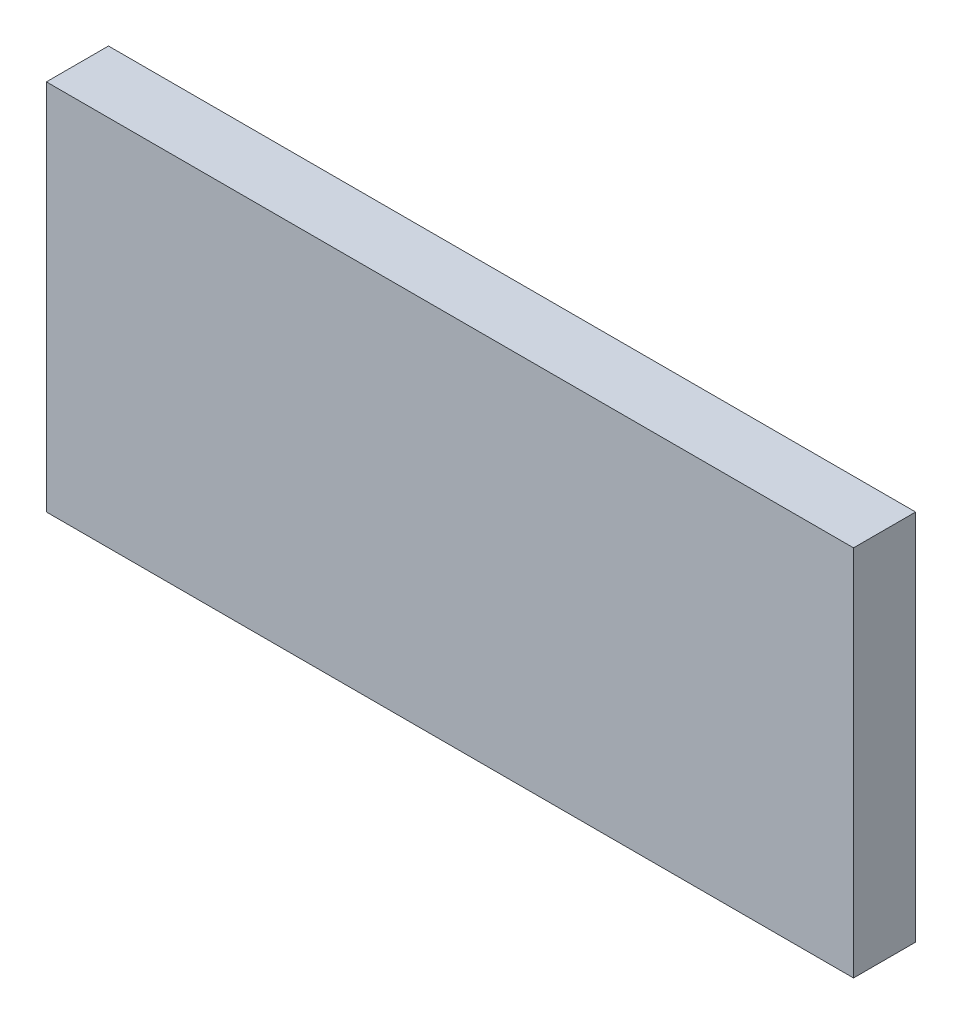
ISO-10303-21;
HEADER;
FILE_DESCRIPTION(('STEP AP214'),'2;1');
FILE_NAME('part.step','',(''),(''),'','','');
FILE_SCHEMA(('AUTOMOTIVE_DESIGN { 1 0 10303 214 1 1 1 1 }'));
ENDSEC;
DATA;
#1=APPLICATION_CONTEXT('core data for automotive mechanical design processes');
#2=APPLICATION_PROTOCOL_DEFINITION('international standard','automotive_design',2000,#1);
#3=PRODUCT_CONTEXT('',#1,'mechanical');
#4=PRODUCT('Part','Part','',(#3));
#5=PRODUCT_RELATED_PRODUCT_CATEGORY('part','',(#4));
#6=PRODUCT_DEFINITION_FORMATION('','',#4);
#7=PRODUCT_DEFINITION_CONTEXT('part definition',#1,'design');
#8=PRODUCT_DEFINITION('design','',#6,#7);
#9=PRODUCT_DEFINITION_SHAPE('','',#8);
#10=(LENGTH_UNIT() NAMED_UNIT(*) SI_UNIT(.MILLI.,.METRE.));
#11=(NAMED_UNIT(*) PLANE_ANGLE_UNIT() SI_UNIT($,.RADIAN.));
#12=(NAMED_UNIT(*) SI_UNIT($,.STERADIAN.) SOLID_ANGLE_UNIT());
#13=UNCERTAINTY_MEASURE_WITH_UNIT(LENGTH_MEASURE(1.E-05),#10,'distance_accuracy_value','');
#14=(GEOMETRIC_REPRESENTATION_CONTEXT(3) GLOBAL_UNCERTAINTY_ASSIGNED_CONTEXT((#13)) GLOBAL_UNIT_ASSIGNED_CONTEXT((#10,
#11,#12)) REPRESENTATION_CONTEXT('',''));
#15=CARTESIAN_POINT('',(0.,0.,0.));
#16=DIRECTION('',(0.,0.,1.));
#17=DIRECTION('',(1.,0.,0.));
#18=AXIS2_PLACEMENT_3D('',#15,#16,#17);
#19=CARTESIAN_POINT('',(32.5,-15.,5.));
#20=DIRECTION('',(-1.,0.,0.));
#21=DIRECTION('',(0.,0.,1.));
#22=AXIS2_PLACEMENT_3D('',#19,#20,#21);
#23=PLANE('',#22);
#24=DIRECTION('',(0.,1.,0.));
#25=VECTOR('',#24,1.);
#26=CARTESIAN_POINT('',(32.5,-15.,0.));
#27=LINE('',#26,#25);
#28=CARTESIAN_POINT('',(32.5,-15.,0.));
#29=VERTEX_POINT('',#28);
#30=CARTESIAN_POINT('',(32.5,15.,0.));
#31=VERTEX_POINT('',#30);
#32=EDGE_CURVE('E95',#29,#31,#27,.T.);
#33=ORIENTED_EDGE('',*,*,#32,.T.);
#34=DIRECTION('',(0.,0.,-1.));
#35=VECTOR('',#34,1.);
#36=CARTESIAN_POINT('',(32.5,15.,5.));
#37=LINE('',#36,#35);
#38=CARTESIAN_POINT('',(32.5,15.,5.));
#39=VERTEX_POINT('',#38);
#40=EDGE_CURVE('E11',#39,#31,#37,.T.);
#41=ORIENTED_EDGE('',*,*,#40,.F.);
#42=DIRECTION('',(0.,1.,0.));
#43=VECTOR('',#42,1.);
#44=CARTESIAN_POINT('',(32.5,-15.,5.));
#45=LINE('',#44,#43);
#46=CARTESIAN_POINT('',(32.5,-15.,5.));
#47=VERTEX_POINT('',#46);
#48=EDGE_CURVE('E83',#47,#39,#45,.T.);
#49=ORIENTED_EDGE('',*,*,#48,.F.);
#50=DIRECTION('',(0.,0.,-1.));
#51=VECTOR('',#50,1.);
#52=CARTESIAN_POINT('',(32.5,-15.,5.));
#53=LINE('',#52,#51);
#54=EDGE_CURVE('E91',#47,#29,#53,.T.);
#55=ORIENTED_EDGE('',*,*,#54,.T.);
#56=EDGE_LOOP('',(#33,#41,#49,#55));
#57=FACE_BOUND('',#56,.T.);
#58=ADVANCED_FACE('F32',(#57),#23,.F.);
#59=CARTESIAN_POINT('',(-32.5,15.,5.));
#60=DIRECTION('',(0.,-1.,0.));
#61=DIRECTION('',(0.,0.,-1.));
#62=AXIS2_PLACEMENT_3D('',#59,#60,#61);
#63=PLANE('',#62);
#64=DIRECTION('',(-1.,0.,0.));
#65=VECTOR('',#64,1.);
#66=CARTESIAN_POINT('',(-32.5,15.,0.));
#67=LINE('',#66,#65);
#68=CARTESIAN_POINT('',(-32.5,15.,0.));
#69=VERTEX_POINT('',#68);
#70=EDGE_CURVE('E87',#31,#69,#67,.T.);
#71=ORIENTED_EDGE('',*,*,#70,.T.);
#72=DIRECTION('',(0.,0.,-1.));
#73=VECTOR('',#72,1.);
#74=CARTESIAN_POINT('',(-32.5,15.,5.));
#75=LINE('',#74,#73);
#76=CARTESIAN_POINT('',(-32.5,15.,5.));
#77=VERTEX_POINT('',#76);
#78=EDGE_CURVE('E40',#77,#69,#75,.T.);
#79=ORIENTED_EDGE('',*,*,#78,.F.);
#80=DIRECTION('',(-1.,0.,0.));
#81=VECTOR('',#80,1.);
#82=CARTESIAN_POINT('',(-32.5,15.,5.));
#83=LINE('',#82,#81);
#84=EDGE_CURVE('E78',#39,#77,#83,.T.);
#85=ORIENTED_EDGE('',*,*,#84,.F.);
#86=ORIENTED_EDGE('',*,*,#40,.T.);
#87=EDGE_LOOP('',(#71,#79,#85,#86));
#88=FACE_BOUND('',#87,.T.);
#89=ADVANCED_FACE('F86',(#88),#63,.F.);
#90=CARTESIAN_POINT('',(-32.5,-15.,5.));
#91=DIRECTION('',(1.,0.,0.));
#92=DIRECTION('',(0.,0.,-1.));
#93=AXIS2_PLACEMENT_3D('',#90,#91,#92);
#94=PLANE('',#93);
#95=DIRECTION('',(0.,-1.,0.));
#96=VECTOR('',#95,1.);
#97=CARTESIAN_POINT('',(-32.5,-15.,0.));
#98=LINE('',#97,#96);
#99=CARTESIAN_POINT('',(-32.5,-15.,0.));
#100=VERTEX_POINT('',#99);
#101=EDGE_CURVE('E65',#69,#100,#98,.T.);
#102=ORIENTED_EDGE('',*,*,#101,.T.);
#103=DIRECTION('',(0.,0.,-1.));
#104=VECTOR('',#103,1.);
#105=CARTESIAN_POINT('',(-32.5,-15.,5.));
#106=LINE('',#105,#104);
#107=CARTESIAN_POINT('',(-32.5,-15.,5.));
#108=VERTEX_POINT('',#107);
#109=EDGE_CURVE('E88',#108,#100,#106,.T.);
#110=ORIENTED_EDGE('',*,*,#109,.F.);
#111=DIRECTION('',(0.,-1.,0.));
#112=VECTOR('',#111,1.);
#113=CARTESIAN_POINT('',(-32.5,-15.,5.));
#114=LINE('',#113,#112);
#115=EDGE_CURVE('E81',#77,#108,#114,.T.);
#116=ORIENTED_EDGE('',*,*,#115,.F.);
#117=ORIENTED_EDGE('',*,*,#78,.T.);
#118=EDGE_LOOP('',(#102,#110,#116,#117));
#119=FACE_BOUND('',#118,.T.);
#120=ADVANCED_FACE('F89',(#119),#94,.F.);
#121=CARTESIAN_POINT('',(-32.5,-15.,5.));
#122=DIRECTION('',(0.,1.,0.));
#123=DIRECTION('',(0.,0.,1.));
#124=AXIS2_PLACEMENT_3D('',#121,#122,#123);
#125=PLANE('',#124);
#126=DIRECTION('',(1.,0.,0.));
#127=VECTOR('',#126,1.);
#128=CARTESIAN_POINT('',(-32.5,-15.,0.));
#129=LINE('',#128,#127);
#130=EDGE_CURVE('E71',#100,#29,#129,.T.);
#131=ORIENTED_EDGE('',*,*,#130,.T.);
#132=ORIENTED_EDGE('',*,*,#54,.F.);
#133=DIRECTION('',(1.,0.,0.));
#134=VECTOR('',#133,1.);
#135=CARTESIAN_POINT('',(-32.5,-15.,5.));
#136=LINE('',#135,#134);
#137=EDGE_CURVE('E48',#108,#47,#136,.T.);
#138=ORIENTED_EDGE('',*,*,#137,.F.);
#139=ORIENTED_EDGE('',*,*,#109,.T.);
#140=EDGE_LOOP('',(#131,#132,#138,#139));
#141=FACE_BOUND('',#140,.T.);
#142=ADVANCED_FACE('F102',(#141),#125,.F.);
#143=CARTESIAN_POINT('',(0.,0.,5.));
#144=DIRECTION('',(0.,0.,-1.));
#145=DIRECTION('',(-1.,0.,0.));
#146=AXIS2_PLACEMENT_3D('',#143,#144,#145);
#147=PLANE('',#146);
#148=ORIENTED_EDGE('',*,*,#48,.T.);
#149=ORIENTED_EDGE('',*,*,#84,.T.);
#150=ORIENTED_EDGE('',*,*,#115,.T.);
#151=ORIENTED_EDGE('',*,*,#137,.T.);
#152=EDGE_LOOP('',(#148,#149,#150,#151));
#153=FACE_BOUND('',#152,.T.);
#154=ADVANCED_FACE('F79',(#153),#147,.F.);
#155=CARTESIAN_POINT('',(0.,0.,0.));
#156=DIRECTION('',(0.,0.,-1.));
#157=DIRECTION('',(-1.,0.,0.));
#158=AXIS2_PLACEMENT_3D('',#155,#156,#157);
#159=PLANE('',#158);
#160=ORIENTED_EDGE('',*,*,#32,.F.);
#161=ORIENTED_EDGE('',*,*,#130,.F.);
#162=ORIENTED_EDGE('',*,*,#101,.F.);
#163=ORIENTED_EDGE('',*,*,#70,.F.);
#164=EDGE_LOOP('',(#160,#161,#162,#163));
#165=FACE_BOUND('',#164,.T.);
#166=ADVANCED_FACE('F105',(#165),#159,.T.);
#167=CLOSED_SHELL('',(#58,#89,#120,#142,#154,#166));
#168=MANIFOLD_SOLID_BREP('B2',#167);
#169=ADVANCED_BREP_SHAPE_REPRESENTATION('',(#18,#168),#14);
#170=SHAPE_DEFINITION_REPRESENTATION(#9,#169);
ENDSEC;
END-ISO-10303-21;
